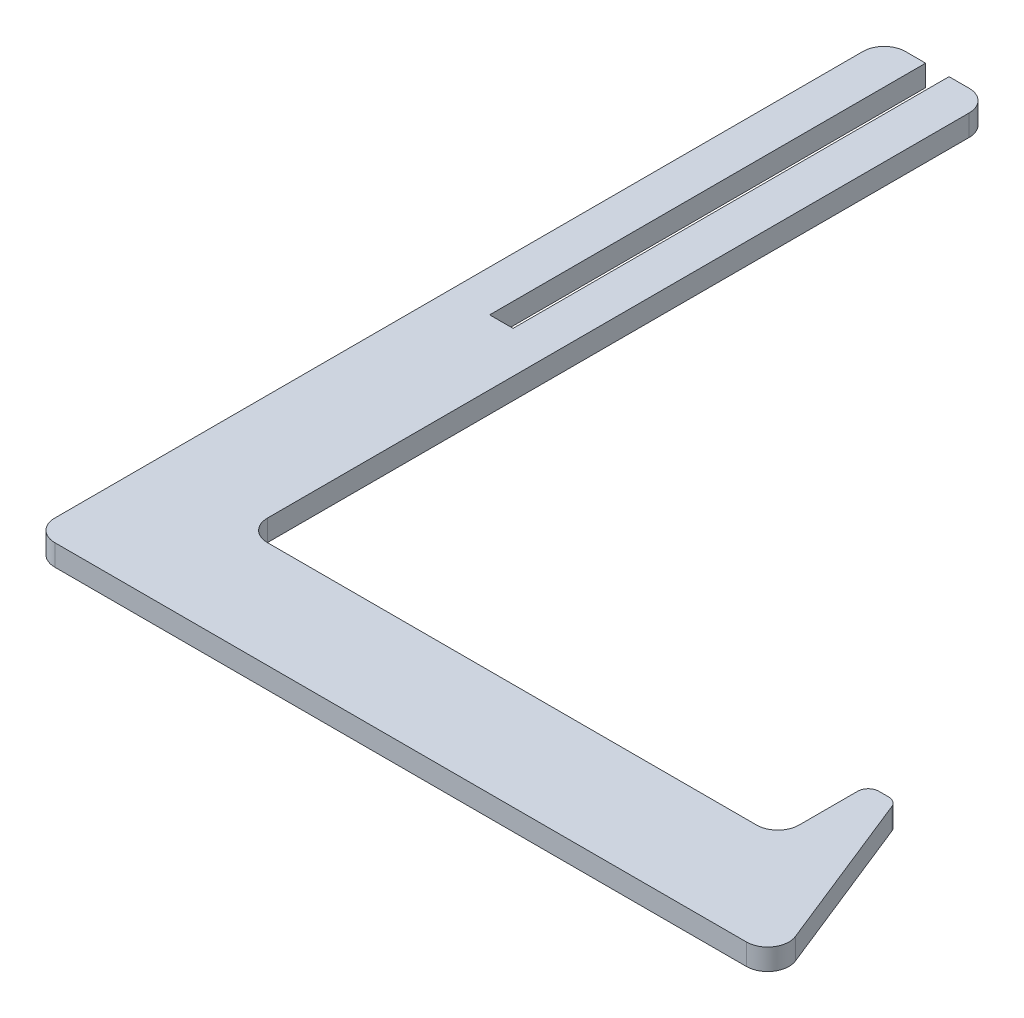
ISO-10303-21;
HEADER;
FILE_DESCRIPTION(('STEP AP214'),'2;1');
FILE_NAME('part.step','',(''),(''),'','','');
FILE_SCHEMA(('AUTOMOTIVE_DESIGN { 1 0 10303 214 1 1 1 1 }'));
ENDSEC;
DATA;
#1=APPLICATION_CONTEXT('core data for automotive mechanical design processes');
#2=APPLICATION_PROTOCOL_DEFINITION('international standard','automotive_design',2000,#1);
#3=PRODUCT_CONTEXT('',#1,'mechanical');
#4=PRODUCT('Part','Part','',(#3));
#5=PRODUCT_RELATED_PRODUCT_CATEGORY('part','',(#4));
#6=PRODUCT_DEFINITION_FORMATION('','',#4);
#7=PRODUCT_DEFINITION_CONTEXT('part definition',#1,'design');
#8=PRODUCT_DEFINITION('design','',#6,#7);
#9=PRODUCT_DEFINITION_SHAPE('','',#8);
#10=(LENGTH_UNIT() NAMED_UNIT(*) SI_UNIT(.MILLI.,.METRE.));
#11=(NAMED_UNIT(*) PLANE_ANGLE_UNIT() SI_UNIT($,.RADIAN.));
#12=(NAMED_UNIT(*) SI_UNIT($,.STERADIAN.) SOLID_ANGLE_UNIT());
#13=UNCERTAINTY_MEASURE_WITH_UNIT(LENGTH_MEASURE(1.E-05),#10,'distance_accuracy_value','');
#14=(GEOMETRIC_REPRESENTATION_CONTEXT(3) GLOBAL_UNCERTAINTY_ASSIGNED_CONTEXT((#13)) GLOBAL_UNIT_ASSIGNED_CONTEXT((#10,
#11,#12)) REPRESENTATION_CONTEXT('',''));
#15=CARTESIAN_POINT('',(0.,0.,0.));
#16=DIRECTION('',(0.,0.,1.));
#17=DIRECTION('',(1.,0.,0.));
#18=AXIS2_PLACEMENT_3D('',#15,#16,#17);
#19=CARTESIAN_POINT('',(0.,2.,-80.));
#20=DIRECTION('',(0.,0.,1.));
#21=DIRECTION('',(1.,0.,0.));
#22=AXIS2_PLACEMENT_3D('',#19,#20,#21);
#23=PLANE('',#22);
#24=DIRECTION('',(-1.,0.,0.));
#25=VECTOR('',#24,1.);
#26=CARTESIAN_POINT('',(0.,2.,-80.));
#27=LINE('',#26,#25);
#28=CARTESIAN_POINT('',(3.9,2.,-80.));
#29=VERTEX_POINT('',#28);
#30=CARTESIAN_POINT('',(2.,2.,-80.));
#31=VERTEX_POINT('',#30);
#32=EDGE_CURVE('E241',#29,#31,#27,.T.);
#33=ORIENTED_EDGE('',*,*,#32,.F.);
#34=DIRECTION('',(0.,1.,0.));
#35=VECTOR('',#34,1.);
#36=CARTESIAN_POINT('',(3.9,-8.,-80.));
#37=LINE('',#36,#35);
#38=CARTESIAN_POINT('',(3.9,0.,-80.));
#39=VERTEX_POINT('',#38);
#40=EDGE_CURVE('E192',#39,#29,#37,.T.);
#41=ORIENTED_EDGE('',*,*,#40,.F.);
#42=DIRECTION('',(-1.,0.,0.));
#43=VECTOR('',#42,1.);
#44=CARTESIAN_POINT('',(0.,0.,-80.));
#45=LINE('',#44,#43);
#46=CARTESIAN_POINT('',(2.,0.,-80.));
#47=VERTEX_POINT('',#46);
#48=EDGE_CURVE('E268',#39,#47,#45,.T.);
#49=ORIENTED_EDGE('',*,*,#48,.T.);
#50=DIRECTION('',(0.,-1.,0.));
#51=VECTOR('',#50,1.);
#52=CARTESIAN_POINT('',(2.,2.,-80.));
#53=LINE('',#52,#51);
#54=EDGE_CURVE('E340',#47,#31,#53,.F.);
#55=ORIENTED_EDGE('',*,*,#54,.T.);
#56=EDGE_LOOP('',(#33,#41,#49,#55));
#57=FACE_BOUND('',#56,.T.);
#58=ADVANCED_FACE('F39',(#57),#23,.F.);
#59=CARTESIAN_POINT('',(70.,2.,0.));
#60=DIRECTION('',(0.,0.,-1.));
#61=DIRECTION('',(-1.,0.,0.));
#62=AXIS2_PLACEMENT_3D('',#59,#60,#61);
#63=PLANE('',#62);
#64=DIRECTION('',(1.,0.,0.));
#65=VECTOR('',#64,1.);
#66=CARTESIAN_POINT('',(70.,2.,0.));
#67=LINE('',#66,#65);
#68=CARTESIAN_POINT('',(2.,2.,0.));
#69=VERTEX_POINT('',#68);
#70=CARTESIAN_POINT('',(67.0459340771462,2.,0.));
#71=VERTEX_POINT('',#70);
#72=EDGE_CURVE('E221',#69,#71,#67,.T.);
#73=ORIENTED_EDGE('',*,*,#72,.F.);
#74=DIRECTION('',(0.,-1.,0.));
#75=VECTOR('',#74,1.);
#76=CARTESIAN_POINT('',(2.,2.,0.));
#77=LINE('',#76,#75);
#78=CARTESIAN_POINT('',(2.,0.,0.));
#79=VERTEX_POINT('',#78);
#80=EDGE_CURVE('E278',#69,#79,#77,.T.);
#81=ORIENTED_EDGE('',*,*,#80,.T.);
#82=DIRECTION('',(1.,0.,0.));
#83=VECTOR('',#82,1.);
#84=CARTESIAN_POINT('',(70.,0.,0.));
#85=LINE('',#84,#83);
#86=CARTESIAN_POINT('',(67.0459340771462,0.,0.));
#87=VERTEX_POINT('',#86);
#88=EDGE_CURVE('E217',#79,#87,#85,.T.);
#89=ORIENTED_EDGE('',*,*,#88,.T.);
#90=DIRECTION('',(0.,-1.,0.));
#91=VECTOR('',#90,1.);
#92=CARTESIAN_POINT('',(67.0459340771462,2.,0.));
#93=LINE('',#92,#91);
#94=EDGE_CURVE('E249',#87,#71,#93,.F.);
#95=ORIENTED_EDGE('',*,*,#94,.T.);
#96=EDGE_LOOP('',(#73,#81,#89,#95));
#97=FACE_BOUND('',#96,.T.);
#98=ADVANCED_FACE('F412',(#97),#63,.F.);
#99=CARTESIAN_POINT('',(60.,2.,-25.));
#100=DIRECTION('',(-0.928476690885259,0.,0.371390676354104));
#101=DIRECTION('',(0.371390676354104,0.,0.928476690885259));
#102=AXIS2_PLACEMENT_3D('',#99,#100,#101);
#103=PLANE('',#102);
#104=DIRECTION('',(-0.371390676354104,0.,-0.928476690885259));
#105=VECTOR('',#104,1.);
#106=CARTESIAN_POINT('',(60.,0.,-25.));
#107=LINE('',#106,#105);
#108=CARTESIAN_POINT('',(68.9028874589167,0.,-2.74278135270821));
#109=VERTEX_POINT('',#108);
#110=CARTESIAN_POINT('',(62.8514437294584,0.,-17.8713906763541));
#111=VERTEX_POINT('',#110);
#112=EDGE_CURVE('E253',#109,#111,#107,.T.);
#113=ORIENTED_EDGE('',*,*,#112,.T.);
#114=DIRECTION('',(0.,1.,0.));
#115=VECTOR('',#114,1.);
#116=CARTESIAN_POINT('',(62.8514437294584,2.,-17.8713906763541));
#117=LINE('',#116,#115);
#118=CARTESIAN_POINT('',(62.8514437294584,2.,-17.8713906763541));
#119=VERTEX_POINT('',#118);
#120=EDGE_CURVE('E357',#111,#119,#117,.T.);
#121=ORIENTED_EDGE('',*,*,#120,.T.);
#122=DIRECTION('',(-0.371390676354104,0.,-0.928476690885259));
#123=VECTOR('',#122,1.);
#124=CARTESIAN_POINT('',(60.,2.,-25.));
#125=LINE('',#124,#123);
#126=CARTESIAN_POINT('',(68.9028874589167,2.,-2.74278135270821));
#127=VERTEX_POINT('',#126);
#128=EDGE_CURVE('E225',#127,#119,#125,.T.);
#129=ORIENTED_EDGE('',*,*,#128,.F.);
#130=DIRECTION('',(0.,-1.,0.));
#131=VECTOR('',#130,1.);
#132=CARTESIAN_POINT('',(68.9028874589167,2.,-2.74278135270821));
#133=LINE('',#132,#131);
#134=EDGE_CURVE('E314',#127,#109,#133,.T.);
#135=ORIENTED_EDGE('',*,*,#134,.T.);
#136=EDGE_LOOP('',(#113,#121,#129,#135));
#137=FACE_BOUND('',#136,.T.);
#138=ADVANCED_FACE('F419',(#137),#103,.F.);
#139=CARTESIAN_POINT('',(60.,2.,-9.99999999999999));
#140=DIRECTION('',(1.,0.,0.));
#141=DIRECTION('',(0.,0.,-1.));
#142=AXIS2_PLACEMENT_3D('',#139,#140,#141);
#143=PLANE('',#142);
#144=DIRECTION('',(0.,0.,1.));
#145=VECTOR('',#144,1.);
#146=CARTESIAN_POINT('',(60.,2.,-9.99999999999999));
#147=LINE('',#146,#145);
#148=CARTESIAN_POINT('',(60.,2.,-17.5));
#149=VERTEX_POINT('',#148);
#150=CARTESIAN_POINT('',(60.,2.,-12.));
#151=VERTEX_POINT('',#150);
#152=EDGE_CURVE('E230',#149,#151,#147,.T.);
#153=ORIENTED_EDGE('',*,*,#152,.F.);
#154=DIRECTION('',(0.,1.,0.));
#155=VECTOR('',#154,1.);
#156=CARTESIAN_POINT('',(60.,2.,-17.5));
#157=LINE('',#156,#155);
#158=CARTESIAN_POINT('',(60.,0.,-17.5));
#159=VERTEX_POINT('',#158);
#160=EDGE_CURVE('E63',#149,#159,#157,.F.);
#161=ORIENTED_EDGE('',*,*,#160,.T.);
#162=DIRECTION('',(0.,0.,1.));
#163=VECTOR('',#162,1.);
#164=CARTESIAN_POINT('',(60.,0.,-9.99999999999999));
#165=LINE('',#164,#163);
#166=CARTESIAN_POINT('',(60.,0.,-12.));
#167=VERTEX_POINT('',#166);
#168=EDGE_CURVE('E257',#159,#167,#165,.T.);
#169=ORIENTED_EDGE('',*,*,#168,.T.);
#170=DIRECTION('',(0.,-1.,0.));
#171=VECTOR('',#170,1.);
#172=CARTESIAN_POINT('',(60.,2.,-12.));
#173=LINE('',#172,#171);
#174=EDGE_CURVE('E325',#167,#151,#173,.F.);
#175=ORIENTED_EDGE('',*,*,#174,.T.);
#176=EDGE_LOOP('',(#153,#161,#169,#175));
#177=FACE_BOUND('',#176,.T.);
#178=ADVANCED_FACE('F433',(#177),#143,.F.);
#179=CARTESIAN_POINT('',(10.,2.,-9.99999999999999));
#180=DIRECTION('',(0.,0.,1.));
#181=DIRECTION('',(1.,0.,0.));
#182=AXIS2_PLACEMENT_3D('',#179,#180,#181);
#183=PLANE('',#182);
#184=DIRECTION('',(-1.,0.,0.));
#185=VECTOR('',#184,1.);
#186=CARTESIAN_POINT('',(10.,2.,-9.99999999999999));
#187=LINE('',#186,#185);
#188=CARTESIAN_POINT('',(58.,2.,-9.99999999999999));
#189=VERTEX_POINT('',#188);
#190=CARTESIAN_POINT('',(12.,2.,-9.99999999999999));
#191=VERTEX_POINT('',#190);
#192=EDGE_CURVE('E233',#189,#191,#187,.T.);
#193=ORIENTED_EDGE('',*,*,#192,.F.);
#194=DIRECTION('',(0.,-1.,0.));
#195=VECTOR('',#194,1.);
#196=CARTESIAN_POINT('',(58.,0.,-9.99999999999999));
#197=LINE('',#196,#195);
#198=CARTESIAN_POINT('',(58.,0.,-9.99999999999999));
#199=VERTEX_POINT('',#198);
#200=EDGE_CURVE('E321',#189,#199,#197,.T.);
#201=ORIENTED_EDGE('',*,*,#200,.T.);
#202=DIRECTION('',(-1.,0.,0.));
#203=VECTOR('',#202,1.);
#204=CARTESIAN_POINT('',(10.,0.,-9.99999999999999));
#205=LINE('',#204,#203);
#206=CARTESIAN_POINT('',(12.,0.,-9.99999999999999));
#207=VERTEX_POINT('',#206);
#208=EDGE_CURVE('E260',#199,#207,#205,.T.);
#209=ORIENTED_EDGE('',*,*,#208,.T.);
#210=DIRECTION('',(0.,-1.,0.));
#211=VECTOR('',#210,1.);
#212=CARTESIAN_POINT('',(12.,2.,-9.99999999999999));
#213=LINE('',#212,#211);
#214=EDGE_CURVE('E318',#207,#191,#213,.F.);
#215=ORIENTED_EDGE('',*,*,#214,.T.);
#216=EDGE_LOOP('',(#193,#201,#209,#215));
#217=FACE_BOUND('',#216,.T.);
#218=ADVANCED_FACE('F442',(#217),#183,.F.);
#219=CARTESIAN_POINT('',(10.,2.,-80.));
#220=DIRECTION('',(-1.,0.,0.));
#221=DIRECTION('',(0.,0.,1.));
#222=AXIS2_PLACEMENT_3D('',#219,#220,#221);
#223=PLANE('',#222);
#224=DIRECTION('',(0.,0.,-1.));
#225=VECTOR('',#224,1.);
#226=CARTESIAN_POINT('',(10.,2.,-80.));
#227=LINE('',#226,#225);
#228=CARTESIAN_POINT('',(10.,2.,-12.));
#229=VERTEX_POINT('',#228);
#230=CARTESIAN_POINT('',(10.,2.,-78.));
#231=VERTEX_POINT('',#230);
#232=EDGE_CURVE('E237',#229,#231,#227,.T.);
#233=ORIENTED_EDGE('',*,*,#232,.F.);
#234=DIRECTION('',(0.,-1.,0.));
#235=VECTOR('',#234,1.);
#236=CARTESIAN_POINT('',(10.,0.,-12.));
#237=LINE('',#236,#235);
#238=CARTESIAN_POINT('',(10.,0.,-12.));
#239=VERTEX_POINT('',#238);
#240=EDGE_CURVE('E332',#229,#239,#237,.T.);
#241=ORIENTED_EDGE('',*,*,#240,.T.);
#242=DIRECTION('',(0.,0.,-1.));
#243=VECTOR('',#242,1.);
#244=CARTESIAN_POINT('',(10.,0.,-80.));
#245=LINE('',#244,#243);
#246=CARTESIAN_POINT('',(10.,0.,-78.));
#247=VERTEX_POINT('',#246);
#248=EDGE_CURVE('E264',#239,#247,#245,.T.);
#249=ORIENTED_EDGE('',*,*,#248,.T.);
#250=DIRECTION('',(0.,-1.,0.));
#251=VECTOR('',#250,1.);
#252=CARTESIAN_POINT('',(10.,2.,-78.));
#253=LINE('',#252,#251);
#254=EDGE_CURVE('E329',#247,#231,#253,.F.);
#255=ORIENTED_EDGE('',*,*,#254,.T.);
#256=EDGE_LOOP('',(#233,#241,#249,#255));
#257=FACE_BOUND('',#256,.T.);
#258=ADVANCED_FACE('F451',(#257),#223,.F.);
#259=CARTESIAN_POINT('',(8.,0.,-80.));
#260=VERTEX_POINT('',#259);
#261=CARTESIAN_POINT('',(6.10000000000001,0.,-80.));
#262=VERTEX_POINT('',#261);
#263=EDGE_CURVE('E269',#260,#262,#45,.T.);
#264=ORIENTED_EDGE('',*,*,#263,.T.);
#265=DIRECTION('',(0.,1.,0.));
#266=VECTOR('',#265,1.);
#267=CARTESIAN_POINT('',(6.10000000000001,-8.,-80.));
#268=LINE('',#267,#266);
#269=CARTESIAN_POINT('',(6.10000000000001,2.,-80.));
#270=VERTEX_POINT('',#269);
#271=EDGE_CURVE('E207',#262,#270,#268,.T.);
#272=ORIENTED_EDGE('',*,*,#271,.T.);
#273=CARTESIAN_POINT('',(8.,2.,-80.));
#274=VERTEX_POINT('',#273);
#275=EDGE_CURVE('E242',#274,#270,#27,.T.);
#276=ORIENTED_EDGE('',*,*,#275,.F.);
#277=DIRECTION('',(0.,-1.,0.));
#278=VECTOR('',#277,1.);
#279=CARTESIAN_POINT('',(8.,2.,-80.));
#280=LINE('',#279,#278);
#281=EDGE_CURVE('E336',#274,#260,#280,.T.);
#282=ORIENTED_EDGE('',*,*,#281,.T.);
#283=EDGE_LOOP('',(#264,#272,#276,#282));
#284=FACE_BOUND('',#283,.T.);
#285=ADVANCED_FACE('F459',(#284),#23,.F.);
#286=CARTESIAN_POINT('',(0.,2.,0.));
#287=DIRECTION('',(1.,0.,0.));
#288=DIRECTION('',(0.,0.,-1.));
#289=AXIS2_PLACEMENT_3D('',#286,#287,#288);
#290=PLANE('',#289);
#291=DIRECTION('',(0.,0.,1.));
#292=VECTOR('',#291,1.);
#293=CARTESIAN_POINT('',(0.,0.,0.));
#294=LINE('',#293,#292);
#295=CARTESIAN_POINT('',(0.,0.,-78.));
#296=VERTEX_POINT('',#295);
#297=CARTESIAN_POINT('',(0.,0.,-2.));
#298=VERTEX_POINT('',#297);
#299=EDGE_CURVE('E226',#296,#298,#294,.T.);
#300=ORIENTED_EDGE('',*,*,#299,.T.);
#301=DIRECTION('',(0.,-1.,0.));
#302=VECTOR('',#301,1.);
#303=CARTESIAN_POINT('',(0.,2.,-2.));
#304=LINE('',#303,#302);
#305=CARTESIAN_POINT('',(0.,2.,-2.));
#306=VERTEX_POINT('',#305);
#307=EDGE_CURVE('E299',#298,#306,#304,.F.);
#308=ORIENTED_EDGE('',*,*,#307,.T.);
#309=DIRECTION('',(0.,0.,1.));
#310=VECTOR('',#309,1.);
#311=CARTESIAN_POINT('',(0.,2.,0.));
#312=LINE('',#311,#310);
#313=CARTESIAN_POINT('',(0.,2.,-78.));
#314=VERTEX_POINT('',#313);
#315=EDGE_CURVE('E245',#314,#306,#312,.T.);
#316=ORIENTED_EDGE('',*,*,#315,.F.);
#317=DIRECTION('',(0.,-1.,0.));
#318=VECTOR('',#317,1.);
#319=CARTESIAN_POINT('',(0.,2.,-78.));
#320=LINE('',#319,#318);
#321=EDGE_CURVE('E295',#314,#296,#320,.T.);
#322=ORIENTED_EDGE('',*,*,#321,.T.);
#323=EDGE_LOOP('',(#300,#308,#316,#322));
#324=FACE_BOUND('',#323,.T.);
#325=ADVANCED_FACE('F401',(#324),#290,.F.);
#326=CARTESIAN_POINT('',(0.,2.,0.));
#327=DIRECTION('',(0.,-1.,0.));
#328=DIRECTION('',(0.,0.,-1.));
#329=AXIS2_PLACEMENT_3D('',#326,#327,#328);
#330=PLANE('',#329);
#331=DIRECTION('',(1.,0.,0.));
#332=VECTOR('',#331,1.);
#333=CARTESIAN_POINT('',(3.90000000000001,2.,-39.));
#334=LINE('',#333,#332);
#335=CARTESIAN_POINT('',(3.90000000000001,2.,-39.));
#336=VERTEX_POINT('',#335);
#337=CARTESIAN_POINT('',(6.10000000000001,2.,-39.));
#338=VERTEX_POINT('',#337);
#339=EDGE_CURVE('E179',#336,#338,#334,.T.);
#340=ORIENTED_EDGE('',*,*,#339,.F.);
#341=DIRECTION('',(0.,0.,1.));
#342=VECTOR('',#341,1.);
#343=CARTESIAN_POINT('',(3.9,2.,-80.));
#344=LINE('',#343,#342);
#345=EDGE_CURVE('E189',#29,#336,#344,.T.);
#346=ORIENTED_EDGE('',*,*,#345,.F.);
#347=ORIENTED_EDGE('',*,*,#32,.T.);
#348=CARTESIAN_POINT('',(2.,2.,-78.));
#349=DIRECTION('',(0.,-1.,0.));
#350=DIRECTION('',(0.,0.,-1.));
#351=AXIS2_PLACEMENT_3D('',#348,#349,#350);
#352=CIRCLE('',#351,2.);
#353=EDGE_CURVE('E305',#31,#314,#352,.F.);
#354=ORIENTED_EDGE('',*,*,#353,.T.);
#355=ORIENTED_EDGE('',*,*,#315,.T.);
#356=CARTESIAN_POINT('',(2.,2.,-2.));
#357=DIRECTION('',(0.,-1.,0.));
#358=DIRECTION('',(0.,0.,-1.));
#359=AXIS2_PLACEMENT_3D('',#356,#357,#358);
#360=CIRCLE('',#359,2.);
#361=EDGE_CURVE('E311',#306,#69,#360,.F.);
#362=ORIENTED_EDGE('',*,*,#361,.T.);
#363=ORIENTED_EDGE('',*,*,#72,.T.);
#364=CARTESIAN_POINT('',(67.0459340771462,2.,-2.));
#365=DIRECTION('',(0.,-1.,0.));
#366=DIRECTION('',(0.,0.,-1.));
#367=AXIS2_PLACEMENT_3D('',#364,#365,#366);
#368=CIRCLE('',#367,2.);
#369=EDGE_CURVE('E308',#71,#127,#368,.F.);
#370=ORIENTED_EDGE('',*,*,#369,.T.);
#371=ORIENTED_EDGE('',*,*,#128,.T.);
#372=CARTESIAN_POINT('',(61.9229670385731,2.,-17.5));
#373=DIRECTION('',(0.,-1.,0.));
#374=DIRECTION('',(0.,0.,-1.));
#375=AXIS2_PLACEMENT_3D('',#372,#373,#374);
#376=CIRCLE('',#375,1.);
#377=CARTESIAN_POINT('',(61.9229670385731,2.,-18.5));
#378=VERTEX_POINT('',#377);
#379=EDGE_CURVE('E364',#119,#378,#376,.F.);
#380=ORIENTED_EDGE('',*,*,#379,.T.);
#381=DIRECTION('',(1.,0.,0.));
#382=VECTOR('',#381,1.);
#383=CARTESIAN_POINT('',(60.,2.,-18.5));
#384=LINE('',#383,#382);
#385=CARTESIAN_POINT('',(61.,2.,-18.5));
#386=VERTEX_POINT('',#385);
#387=EDGE_CURVE('E206',#386,#378,#384,.T.);
#388=ORIENTED_EDGE('',*,*,#387,.F.);
#389=CARTESIAN_POINT('',(61.,2.,-17.5));
#390=DIRECTION('',(0.,-1.,0.));
#391=DIRECTION('',(0.,0.,-1.));
#392=AXIS2_PLACEMENT_3D('',#389,#390,#391);
#393=CIRCLE('',#392,1.);
#394=EDGE_CURVE('E361',#386,#149,#393,.F.);
#395=ORIENTED_EDGE('',*,*,#394,.T.);
#396=ORIENTED_EDGE('',*,*,#152,.T.);
#397=CARTESIAN_POINT('',(58.,2.,-12.));
#398=DIRECTION('',(0.,-1.,0.));
#399=DIRECTION('',(0.,0.,-1.));
#400=AXIS2_PLACEMENT_3D('',#397,#398,#399);
#401=CIRCLE('',#400,2.);
#402=EDGE_CURVE('E348',#151,#189,#401,.T.);
#403=ORIENTED_EDGE('',*,*,#402,.T.);
#404=ORIENTED_EDGE('',*,*,#192,.T.);
#405=CARTESIAN_POINT('',(12.,2.,-12.));
#406=DIRECTION('',(0.,-1.,0.));
#407=DIRECTION('',(0.,0.,-1.));
#408=AXIS2_PLACEMENT_3D('',#405,#406,#407);
#409=CIRCLE('',#408,2.);
#410=EDGE_CURVE('E354',#191,#229,#409,.T.);
#411=ORIENTED_EDGE('',*,*,#410,.T.);
#412=ORIENTED_EDGE('',*,*,#232,.T.);
#413=CARTESIAN_POINT('',(8.,2.,-78.));
#414=DIRECTION('',(0.,-1.,0.));
#415=DIRECTION('',(0.,0.,-1.));
#416=AXIS2_PLACEMENT_3D('',#413,#414,#415);
#417=CIRCLE('',#416,2.);
#418=EDGE_CURVE('E302',#231,#274,#417,.F.);
#419=ORIENTED_EDGE('',*,*,#418,.T.);
#420=ORIENTED_EDGE('',*,*,#275,.T.);
#421=DIRECTION('',(0.,0.,-1.));
#422=VECTOR('',#421,1.);
#423=CARTESIAN_POINT('',(6.10000000000001,2.,-80.));
#424=LINE('',#423,#422);
#425=EDGE_CURVE('E186',#338,#270,#424,.T.);
#426=ORIENTED_EDGE('',*,*,#425,.F.);
#427=EDGE_LOOP('',(#340,#346,#347,#354,#355,#362,#363,#370,#371,#380,#388,#395,#396,#403,#404,
#411,#412,#419,#420,#426));
#428=FACE_BOUND('',#427,.T.);
#429=ADVANCED_FACE('F197',(#428),#330,.F.);
#430=CARTESIAN_POINT('',(0.,0.,0.));
#431=DIRECTION('',(0.,-1.,0.));
#432=DIRECTION('',(0.,0.,-1.));
#433=AXIS2_PLACEMENT_3D('',#430,#431,#432);
#434=PLANE('',#433);
#435=DIRECTION('',(0.,0.,-1.));
#436=VECTOR('',#435,1.);
#437=CARTESIAN_POINT('',(3.90000000000001,0.,0.));
#438=LINE('',#437,#436);
#439=CARTESIAN_POINT('',(3.90000000000001,0.,-39.));
#440=VERTEX_POINT('',#439);
#441=EDGE_CURVE('E11',#440,#39,#438,.T.);
#442=ORIENTED_EDGE('',*,*,#441,.F.);
#443=DIRECTION('',(-1.,0.,0.));
#444=VECTOR('',#443,1.);
#445=CARTESIAN_POINT('',(0.,0.,-39.));
#446=LINE('',#445,#444);
#447=CARTESIAN_POINT('',(6.10000000000001,0.,-39.));
#448=VERTEX_POINT('',#447);
#449=EDGE_CURVE('E182',#448,#440,#446,.T.);
#450=ORIENTED_EDGE('',*,*,#449,.F.);
#451=DIRECTION('',(0.,0.,1.));
#452=VECTOR('',#451,1.);
#453=CARTESIAN_POINT('',(6.10000000000002,0.,0.));
#454=LINE('',#453,#452);
#455=EDGE_CURVE('E48',#262,#448,#454,.T.);
#456=ORIENTED_EDGE('',*,*,#455,.F.);
#457=ORIENTED_EDGE('',*,*,#263,.F.);
#458=CARTESIAN_POINT('',(8.,0.,-78.));
#459=DIRECTION('',(0.,-1.,0.));
#460=DIRECTION('',(0.,0.,-1.));
#461=AXIS2_PLACEMENT_3D('',#458,#459,#460);
#462=CIRCLE('',#461,2.);
#463=EDGE_CURVE('E282',#260,#247,#462,.T.);
#464=ORIENTED_EDGE('',*,*,#463,.T.);
#465=ORIENTED_EDGE('',*,*,#248,.F.);
#466=CARTESIAN_POINT('',(12.,0.,-12.));
#467=DIRECTION('',(0.,-1.,0.));
#468=DIRECTION('',(0.,0.,-1.));
#469=AXIS2_PLACEMENT_3D('',#466,#467,#468);
#470=CIRCLE('',#469,2.);
#471=EDGE_CURVE('E351',#239,#207,#470,.F.);
#472=ORIENTED_EDGE('',*,*,#471,.T.);
#473=ORIENTED_EDGE('',*,*,#208,.F.);
#474=CARTESIAN_POINT('',(58.,0.,-12.));
#475=DIRECTION('',(0.,-1.,0.));
#476=DIRECTION('',(0.,0.,-1.));
#477=AXIS2_PLACEMENT_3D('',#474,#475,#476);
#478=CIRCLE('',#477,2.);
#479=EDGE_CURVE('E344',#199,#167,#478,.F.);
#480=ORIENTED_EDGE('',*,*,#479,.T.);
#481=ORIENTED_EDGE('',*,*,#168,.F.);
#482=CARTESIAN_POINT('',(61.,0.,-17.5));
#483=DIRECTION('',(0.,-1.,0.));
#484=DIRECTION('',(0.,0.,-1.));
#485=AXIS2_PLACEMENT_3D('',#482,#483,#484);
#486=CIRCLE('',#485,1.);
#487=CARTESIAN_POINT('',(61.,0.,-18.5));
#488=VERTEX_POINT('',#487);
#489=EDGE_CURVE('E374',#159,#488,#486,.T.);
#490=ORIENTED_EDGE('',*,*,#489,.T.);
#491=DIRECTION('',(1.,0.,0.));
#492=VECTOR('',#491,1.);
#493=CARTESIAN_POINT('',(60.,0.,-18.5));
#494=LINE('',#493,#492);
#495=CARTESIAN_POINT('',(61.9229670385731,0.,-18.5));
#496=VERTEX_POINT('',#495);
#497=EDGE_CURVE('E213',#488,#496,#494,.T.);
#498=ORIENTED_EDGE('',*,*,#497,.T.);
#499=CARTESIAN_POINT('',(61.9229670385731,0.,-17.5));
#500=DIRECTION('',(0.,-1.,0.));
#501=DIRECTION('',(0.,0.,-1.));
#502=AXIS2_PLACEMENT_3D('',#499,#500,#501);
#503=CIRCLE('',#502,1.);
#504=EDGE_CURVE('E377',#496,#111,#503,.T.);
#505=ORIENTED_EDGE('',*,*,#504,.T.);
#506=ORIENTED_EDGE('',*,*,#112,.F.);
#507=CARTESIAN_POINT('',(67.0459340771462,0.,-2.));
#508=DIRECTION('',(0.,-1.,0.));
#509=DIRECTION('',(0.,0.,-1.));
#510=AXIS2_PLACEMENT_3D('',#507,#508,#509);
#511=CIRCLE('',#510,2.);
#512=EDGE_CURVE('E289',#109,#87,#511,.T.);
#513=ORIENTED_EDGE('',*,*,#512,.T.);
#514=ORIENTED_EDGE('',*,*,#88,.F.);
#515=CARTESIAN_POINT('',(2.,0.,-2.));
#516=DIRECTION('',(0.,-1.,0.));
#517=DIRECTION('',(0.,0.,-1.));
#518=AXIS2_PLACEMENT_3D('',#515,#516,#517);
#519=CIRCLE('',#518,2.);
#520=EDGE_CURVE('E292',#79,#298,#519,.T.);
#521=ORIENTED_EDGE('',*,*,#520,.T.);
#522=ORIENTED_EDGE('',*,*,#299,.F.);
#523=CARTESIAN_POINT('',(2.,0.,-78.));
#524=DIRECTION('',(0.,-1.,0.));
#525=DIRECTION('',(0.,0.,-1.));
#526=AXIS2_PLACEMENT_3D('',#523,#524,#525);
#527=CIRCLE('',#526,2.);
#528=EDGE_CURVE('E285',#296,#47,#527,.T.);
#529=ORIENTED_EDGE('',*,*,#528,.T.);
#530=ORIENTED_EDGE('',*,*,#48,.F.);
#531=EDGE_LOOP('',(#442,#450,#456,#457,#464,#465,#472,#473,#480,#481,#490,#498,#505,#506,#513,
#514,#521,#522,#529,#530));
#532=FACE_BOUND('',#531,.T.);
#533=ADVANCED_FACE('F389',(#532),#434,.T.);
#534=CARTESIAN_POINT('',(2.,2.,-2.));
#535=DIRECTION('',(0.,-1.,0.));
#536=DIRECTION('',(0.,0.,-1.));
#537=AXIS2_PLACEMENT_3D('',#534,#535,#536);
#538=CYLINDRICAL_SURFACE('',#537,2.);
#539=ORIENTED_EDGE('',*,*,#361,.F.);
#540=ORIENTED_EDGE('',*,*,#307,.F.);
#541=ORIENTED_EDGE('',*,*,#520,.F.);
#542=ORIENTED_EDGE('',*,*,#80,.F.);
#543=EDGE_LOOP('',(#539,#540,#541,#542));
#544=FACE_BOUND('',#543,.T.);
#545=ADVANCED_FACE('F407',(#544),#538,.T.);
#546=CARTESIAN_POINT('',(67.0459340771462,2.,-2.));
#547=DIRECTION('',(0.,-1.,0.));
#548=DIRECTION('',(0.,0.,-1.));
#549=AXIS2_PLACEMENT_3D('',#546,#547,#548);
#550=CYLINDRICAL_SURFACE('',#549,2.);
#551=ORIENTED_EDGE('',*,*,#369,.F.);
#552=ORIENTED_EDGE('',*,*,#94,.F.);
#553=ORIENTED_EDGE('',*,*,#512,.F.);
#554=ORIENTED_EDGE('',*,*,#134,.F.);
#555=EDGE_LOOP('',(#551,#552,#553,#554));
#556=FACE_BOUND('',#555,.T.);
#557=ADVANCED_FACE('F415',(#556),#550,.T.);
#558=CARTESIAN_POINT('',(58.,2.,-12.));
#559=DIRECTION('',(0.,1.,0.));
#560=DIRECTION('',(0.,0.,1.));
#561=AXIS2_PLACEMENT_3D('',#558,#559,#560);
#562=CYLINDRICAL_SURFACE('',#561,2.);
#563=ORIENTED_EDGE('',*,*,#402,.F.);
#564=ORIENTED_EDGE('',*,*,#174,.F.);
#565=ORIENTED_EDGE('',*,*,#479,.F.);
#566=ORIENTED_EDGE('',*,*,#200,.F.);
#567=EDGE_LOOP('',(#563,#564,#565,#566));
#568=FACE_BOUND('',#567,.T.);
#569=ADVANCED_FACE('F438',(#568),#562,.F.);
#570=CARTESIAN_POINT('',(12.,2.,-12.));
#571=DIRECTION('',(0.,1.,0.));
#572=DIRECTION('',(0.,0.,1.));
#573=AXIS2_PLACEMENT_3D('',#570,#571,#572);
#574=CYLINDRICAL_SURFACE('',#573,2.);
#575=ORIENTED_EDGE('',*,*,#410,.F.);
#576=ORIENTED_EDGE('',*,*,#214,.F.);
#577=ORIENTED_EDGE('',*,*,#471,.F.);
#578=ORIENTED_EDGE('',*,*,#240,.F.);
#579=EDGE_LOOP('',(#575,#576,#577,#578));
#580=FACE_BOUND('',#579,.T.);
#581=ADVANCED_FACE('F446',(#580),#574,.F.);
#582=CARTESIAN_POINT('',(2.,2.,-78.));
#583=DIRECTION('',(0.,-1.,0.));
#584=DIRECTION('',(0.,0.,-1.));
#585=AXIS2_PLACEMENT_3D('',#582,#583,#584);
#586=CYLINDRICAL_SURFACE('',#585,2.);
#587=ORIENTED_EDGE('',*,*,#353,.F.);
#588=ORIENTED_EDGE('',*,*,#54,.F.);
#589=ORIENTED_EDGE('',*,*,#528,.F.);
#590=ORIENTED_EDGE('',*,*,#321,.F.);
#591=EDGE_LOOP('',(#587,#588,#589,#590));
#592=FACE_BOUND('',#591,.T.);
#593=ADVANCED_FACE('F404',(#592),#586,.T.);
#594=CARTESIAN_POINT('',(8.,2.,-78.));
#595=DIRECTION('',(0.,-1.,0.));
#596=DIRECTION('',(0.,0.,-1.));
#597=AXIS2_PLACEMENT_3D('',#594,#595,#596);
#598=CYLINDRICAL_SURFACE('',#597,2.);
#599=ORIENTED_EDGE('',*,*,#418,.F.);
#600=ORIENTED_EDGE('',*,*,#254,.F.);
#601=ORIENTED_EDGE('',*,*,#463,.F.);
#602=ORIENTED_EDGE('',*,*,#281,.F.);
#603=EDGE_LOOP('',(#599,#600,#601,#602));
#604=FACE_BOUND('',#603,.T.);
#605=ADVANCED_FACE('F455',(#604),#598,.T.);
#606=CARTESIAN_POINT('',(60.,0.,-18.5));
#607=DIRECTION('',(0.,0.,1.));
#608=DIRECTION('',(1.,0.,0.));
#609=AXIS2_PLACEMENT_3D('',#606,#607,#608);
#610=PLANE('',#609);
#611=ORIENTED_EDGE('',*,*,#387,.T.);
#612=DIRECTION('',(0.,1.,0.));
#613=VECTOR('',#612,1.);
#614=CARTESIAN_POINT('',(61.9229670385731,0.,-18.5));
#615=LINE('',#614,#613);
#616=EDGE_CURVE('E371',#378,#496,#615,.F.);
#617=ORIENTED_EDGE('',*,*,#616,.T.);
#618=ORIENTED_EDGE('',*,*,#497,.F.);
#619=DIRECTION('',(0.,1.,0.));
#620=VECTOR('',#619,1.);
#621=CARTESIAN_POINT('',(61.,0.,-18.5));
#622=LINE('',#621,#620);
#623=EDGE_CURVE('E367',#488,#386,#622,.T.);
#624=ORIENTED_EDGE('',*,*,#623,.T.);
#625=EDGE_LOOP('',(#611,#617,#618,#624));
#626=FACE_BOUND('',#625,.T.);
#627=ADVANCED_FACE('F428',(#626),#610,.F.);
#628=CARTESIAN_POINT('',(61.9229670385731,2.,-17.5));
#629=DIRECTION('',(0.,1.,0.));
#630=DIRECTION('',(0.,0.,1.));
#631=AXIS2_PLACEMENT_3D('',#628,#629,#630);
#632=CYLINDRICAL_SURFACE('',#631,1.);
#633=ORIENTED_EDGE('',*,*,#504,.F.);
#634=ORIENTED_EDGE('',*,*,#616,.F.);
#635=ORIENTED_EDGE('',*,*,#379,.F.);
#636=ORIENTED_EDGE('',*,*,#120,.F.);
#637=EDGE_LOOP('',(#633,#634,#635,#636));
#638=FACE_BOUND('',#637,.T.);
#639=ADVANCED_FACE('F424',(#638),#632,.T.);
#640=CARTESIAN_POINT('',(61.,0.,-17.5));
#641=DIRECTION('',(0.,1.,0.));
#642=DIRECTION('',(0.,0.,1.));
#643=AXIS2_PLACEMENT_3D('',#640,#641,#642);
#644=CYLINDRICAL_SURFACE('',#643,1.);
#645=ORIENTED_EDGE('',*,*,#489,.F.);
#646=ORIENTED_EDGE('',*,*,#160,.F.);
#647=ORIENTED_EDGE('',*,*,#394,.F.);
#648=ORIENTED_EDGE('',*,*,#623,.F.);
#649=EDGE_LOOP('',(#645,#646,#647,#648));
#650=FACE_BOUND('',#649,.T.);
#651=ADVANCED_FACE('F41',(#650),#644,.T.);
#652=CARTESIAN_POINT('',(3.9,-8.,-80.));
#653=DIRECTION('',(-1.,0.,0.));
#654=DIRECTION('',(0.,0.,1.));
#655=AXIS2_PLACEMENT_3D('',#652,#653,#654);
#656=PLANE('',#655);
#657=ORIENTED_EDGE('',*,*,#441,.T.);
#658=ORIENTED_EDGE('',*,*,#40,.T.);
#659=ORIENTED_EDGE('',*,*,#345,.T.);
#660=DIRECTION('',(0.,1.,0.));
#661=VECTOR('',#660,1.);
#662=CARTESIAN_POINT('',(3.90000000000001,-8.,-39.));
#663=LINE('',#662,#661);
#664=EDGE_CURVE('E175',#440,#336,#663,.T.);
#665=ORIENTED_EDGE('',*,*,#664,.F.);
#666=EDGE_LOOP('',(#657,#658,#659,#665));
#667=FACE_BOUND('',#666,.T.);
#668=ADVANCED_FACE('F190',(#667),#656,.F.);
#669=CARTESIAN_POINT('',(6.10000000000001,-8.,-80.));
#670=DIRECTION('',(1.,0.,0.));
#671=DIRECTION('',(0.,0.,-1.));
#672=AXIS2_PLACEMENT_3D('',#669,#670,#671);
#673=PLANE('',#672);
#674=ORIENTED_EDGE('',*,*,#455,.T.);
#675=DIRECTION('',(0.,1.,0.));
#676=VECTOR('',#675,1.);
#677=CARTESIAN_POINT('',(6.10000000000001,-8.,-39.));
#678=LINE('',#677,#676);
#679=EDGE_CURVE('E55',#448,#338,#678,.T.);
#680=ORIENTED_EDGE('',*,*,#679,.T.);
#681=ORIENTED_EDGE('',*,*,#425,.T.);
#682=ORIENTED_EDGE('',*,*,#271,.F.);
#683=EDGE_LOOP('',(#674,#680,#681,#682));
#684=FACE_BOUND('',#683,.T.);
#685=ADVANCED_FACE('F386',(#684),#673,.F.);
#686=CARTESIAN_POINT('',(3.90000000000001,-8.,-39.));
#687=DIRECTION('',(0.,0.,1.));
#688=DIRECTION('',(1.,0.,0.));
#689=AXIS2_PLACEMENT_3D('',#686,#687,#688);
#690=PLANE('',#689);
#691=ORIENTED_EDGE('',*,*,#449,.T.);
#692=ORIENTED_EDGE('',*,*,#664,.T.);
#693=ORIENTED_EDGE('',*,*,#339,.T.);
#694=ORIENTED_EDGE('',*,*,#679,.F.);
#695=EDGE_LOOP('',(#691,#692,#693,#694));
#696=FACE_BOUND('',#695,.T.);
#697=ADVANCED_FACE('F177',(#696),#690,.F.);
#698=CLOSED_SHELL('',(#58,#98,#138,#178,#218,#258,#285,#325,#429,#533,#545,#557,#569,#581,#593,
#605,#627,#639,#651,#668,#685,#697));
#699=MANIFOLD_SOLID_BREP('B2',#698);
#700=ADVANCED_BREP_SHAPE_REPRESENTATION('',(#18,#699),#14);
#701=SHAPE_DEFINITION_REPRESENTATION(#9,#700);
ENDSEC;
END-ISO-10303-21;
